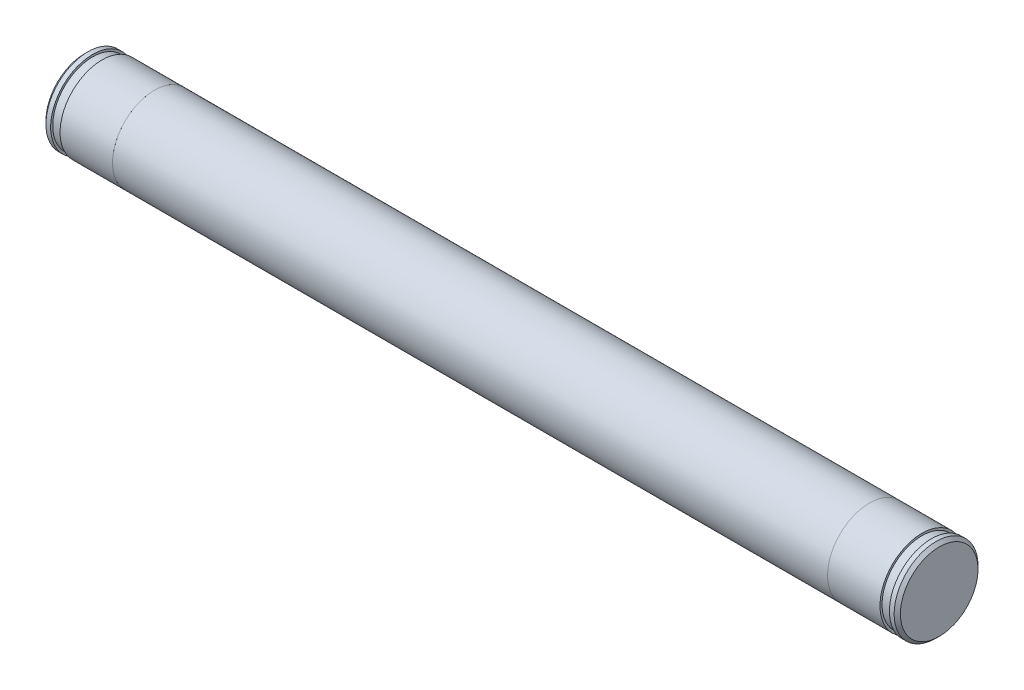
ISO-10303-21;
HEADER;
FILE_DESCRIPTION(('STEP AP214'),'2;1');
FILE_NAME('part.step','',(''),(''),'','','');
FILE_SCHEMA(('AUTOMOTIVE_DESIGN { 1 0 10303 214 1 1 1 1 }'));
ENDSEC;
DATA;
#1=APPLICATION_CONTEXT('core data for automotive mechanical design processes');
#2=APPLICATION_PROTOCOL_DEFINITION('international standard','automotive_design',2000,#1);
#3=PRODUCT_CONTEXT('',#1,'mechanical');
#4=PRODUCT('Part','Part','',(#3));
#5=PRODUCT_RELATED_PRODUCT_CATEGORY('part','',(#4));
#6=PRODUCT_DEFINITION_FORMATION('','',#4);
#7=PRODUCT_DEFINITION_CONTEXT('part definition',#1,'design');
#8=PRODUCT_DEFINITION('design','',#6,#7);
#9=PRODUCT_DEFINITION_SHAPE('','',#8);
#10=(LENGTH_UNIT() NAMED_UNIT(*) SI_UNIT(.MILLI.,.METRE.));
#11=(NAMED_UNIT(*) PLANE_ANGLE_UNIT() SI_UNIT($,.RADIAN.));
#12=(NAMED_UNIT(*) SI_UNIT($,.STERADIAN.) SOLID_ANGLE_UNIT());
#13=UNCERTAINTY_MEASURE_WITH_UNIT(LENGTH_MEASURE(1.E-05),#10,'distance_accuracy_value','');
#14=(GEOMETRIC_REPRESENTATION_CONTEXT(3) GLOBAL_UNCERTAINTY_ASSIGNED_CONTEXT((#13)) GLOBAL_UNIT_ASSIGNED_CONTEXT((#10,
#11,#12)) REPRESENTATION_CONTEXT('',''));
#15=CARTESIAN_POINT('',(0.,0.,0.));
#16=DIRECTION('',(0.,0.,1.));
#17=DIRECTION('',(1.,0.,0.));
#18=AXIS2_PLACEMENT_3D('',#15,#16,#17);
#19=CARTESIAN_POINT('',(40.75,0.,0.));
#20=DIRECTION('',(1.,0.,0.));
#21=DIRECTION('',(0.,0.,-1.));
#22=AXIS2_PLACEMENT_3D('',#19,#20,#21);
#23=PLANE('',#22);
#24=CARTESIAN_POINT('',(40.7499999999459,0.,0.));
#25=DIRECTION('',(-1.,0.,0.));
#26=DIRECTION('',(0.,0.,1.));
#27=AXIS2_PLACEMENT_3D('',#24,#25,#26);
#28=CIRCLE('',#27,3.69999999992388);
#29=CARTESIAN_POINT('',(40.7499999999459,0.,3.69999999992388));
#30=VERTEX_POINT('',#29);
#31=EDGE_CURVE('E18',#30,#30,#28,.T.);
#32=ORIENTED_EDGE('',*,*,#31,.F.);
#33=EDGE_LOOP('',(#32));
#34=FACE_BOUND('',#33,.T.);
#35=ADVANCED_FACE('F15',(#34),#23,.T.);
#36=CARTESIAN_POINT('',(-40.75,0.,0.));
#37=DIRECTION('',(-1.,0.,0.));
#38=DIRECTION('',(0.,0.,1.));
#39=AXIS2_PLACEMENT_3D('',#36,#37,#38);
#40=PLANE('',#39);
#41=CARTESIAN_POINT('',(-40.7500000000027,0.,0.));
#42=DIRECTION('',(1.,0.,0.));
#43=DIRECTION('',(0.,0.,-1.));
#44=AXIS2_PLACEMENT_3D('',#41,#42,#43);
#45=CIRCLE('',#44,3.69999999998072);
#46=CARTESIAN_POINT('',(-40.7500000000027,0.,-3.69999999998072));
#47=VERTEX_POINT('',#46);
#48=EDGE_CURVE('E62',#47,#47,#45,.T.);
#49=ORIENTED_EDGE('',*,*,#48,.F.);
#50=EDGE_LOOP('',(#49));
#51=FACE_BOUND('',#50,.T.);
#52=ADVANCED_FACE('F75',(#51),#40,.T.);
#53=CARTESIAN_POINT('',(40.4499999999643,0.,0.));
#54=DIRECTION('',(-1.,0.,0.));
#55=DIRECTION('',(0.,0.,1.));
#56=AXIS2_PLACEMENT_3D('',#53,#54,#55);
#57=CONICAL_SURFACE('',#56,3.99999999990541,0.785398163397448);
#58=ORIENTED_EDGE('',*,*,#31,.T.);
#59=EDGE_LOOP('',(#58));
#60=FACE_BOUND('',#59,.T.);
#61=CARTESIAN_POINT('',(40.45,0.,0.));
#62=DIRECTION('',(1.,0.,0.));
#63=DIRECTION('',(0.,0.,-1.));
#64=AXIS2_PLACEMENT_3D('',#61,#62,#63);
#65=CIRCLE('',#64,4.);
#66=CARTESIAN_POINT('',(40.45,0.,-4.));
#67=VERTEX_POINT('',#66);
#68=EDGE_CURVE('E64',#67,#67,#65,.F.);
#69=ORIENTED_EDGE('',*,*,#68,.F.);
#70=EDGE_LOOP('',(#69));
#71=FACE_BOUND('',#70,.T.);
#72=ADVANCED_FACE('F71',(#60,#71),#57,.T.);
#73=CARTESIAN_POINT('',(-40.4499999999643,0.,0.));
#74=DIRECTION('',(1.,0.,0.));
#75=DIRECTION('',(0.,0.,-1.));
#76=AXIS2_PLACEMENT_3D('',#73,#74,#75);
#77=CONICAL_SURFACE('',#76,4.0000000000191,0.785398163397448);
#78=ORIENTED_EDGE('',*,*,#48,.T.);
#79=EDGE_LOOP('',(#78));
#80=FACE_BOUND('',#79,.T.);
#81=CARTESIAN_POINT('',(-40.45,0.,0.));
#82=DIRECTION('',(1.,0.,0.));
#83=DIRECTION('',(0.,0.,-1.));
#84=AXIS2_PLACEMENT_3D('',#81,#82,#83);
#85=CIRCLE('',#84,4.);
#86=CARTESIAN_POINT('',(-40.45,0.,-4.));
#87=VERTEX_POINT('',#86);
#88=EDGE_CURVE('E61',#87,#87,#85,.T.);
#89=ORIENTED_EDGE('',*,*,#88,.F.);
#90=EDGE_LOOP('',(#89));
#91=FACE_BOUND('',#90,.T.);
#92=ADVANCED_FACE('F135',(#80,#91),#77,.T.);
#93=CARTESIAN_POINT('',(40.75,0.,0.));
#94=DIRECTION('',(1.,0.,0.));
#95=DIRECTION('',(0.,0.,-1.));
#96=AXIS2_PLACEMENT_3D('',#93,#94,#95);
#97=CYLINDRICAL_SURFACE('',#96,4.);
#98=CARTESIAN_POINT('',(40.,0.,0.));
#99=DIRECTION('',(1.,0.,0.));
#100=DIRECTION('',(0.,0.,-1.));
#101=AXIS2_PLACEMENT_3D('',#98,#99,#100);
#102=CIRCLE('',#101,4.);
#103=CARTESIAN_POINT('',(40.,0.,-4.));
#104=VERTEX_POINT('',#103);
#105=EDGE_CURVE('E59',#104,#104,#102,.F.);
#106=ORIENTED_EDGE('',*,*,#105,.F.);
#107=EDGE_LOOP('',(#106));
#108=FACE_BOUND('',#107,.T.);
#109=ORIENTED_EDGE('',*,*,#68,.T.);
#110=EDGE_LOOP('',(#109));
#111=FACE_BOUND('',#110,.T.);
#112=ADVANCED_FACE('F131',(#108,#111),#97,.T.);
#113=CARTESIAN_POINT('',(40.75,0.,0.));
#114=DIRECTION('',(1.,0.,0.));
#115=DIRECTION('',(0.,0.,-1.));
#116=AXIS2_PLACEMENT_3D('',#113,#114,#115);
#117=CYLINDRICAL_SURFACE('',#116,4.);
#118=ORIENTED_EDGE('',*,*,#88,.T.);
#119=EDGE_LOOP('',(#118));
#120=FACE_BOUND('',#119,.T.);
#121=CARTESIAN_POINT('',(-40.,0.,0.));
#122=DIRECTION('',(1.,0.,0.));
#123=DIRECTION('',(0.,0.,-1.));
#124=AXIS2_PLACEMENT_3D('',#121,#122,#123);
#125=CIRCLE('',#124,4.);
#126=CARTESIAN_POINT('',(-40.,0.,-4.));
#127=VERTEX_POINT('',#126);
#128=EDGE_CURVE('E56',#127,#127,#125,.T.);
#129=ORIENTED_EDGE('',*,*,#128,.F.);
#130=EDGE_LOOP('',(#129));
#131=FACE_BOUND('',#130,.T.);
#132=ADVANCED_FACE('F127',(#120,#131),#117,.T.);
#133=CARTESIAN_POINT('',(40.,4.00000000000001,0.));
#134=DIRECTION('',(-1.,0.,0.));
#135=DIRECTION('',(0.,0.,1.));
#136=AXIS2_PLACEMENT_3D('',#133,#134,#135);
#137=PLANE('',#136);
#138=CARTESIAN_POINT('',(40.,0.,0.));
#139=DIRECTION('',(1.,0.,0.));
#140=DIRECTION('',(0.,0.,-1.));
#141=AXIS2_PLACEMENT_3D('',#138,#139,#140);
#142=CIRCLE('',#141,3.8);
#143=CARTESIAN_POINT('',(40.,0.,-3.8));
#144=VERTEX_POINT('',#143);
#145=EDGE_CURVE('E53',#144,#144,#142,.F.);
#146=ORIENTED_EDGE('',*,*,#145,.F.);
#147=EDGE_LOOP('',(#146));
#148=FACE_BOUND('',#147,.T.);
#149=ORIENTED_EDGE('',*,*,#105,.T.);
#150=EDGE_LOOP('',(#149));
#151=FACE_BOUND('',#150,.T.);
#152=ADVANCED_FACE('F123',(#148,#151),#137,.T.);
#153=CARTESIAN_POINT('',(-40.,4.00000000000001,0.));
#154=DIRECTION('',(1.,0.,0.));
#155=DIRECTION('',(0.,0.,-1.));
#156=AXIS2_PLACEMENT_3D('',#153,#154,#155);
#157=PLANE('',#156);
#158=CARTESIAN_POINT('',(-40.,0.,0.));
#159=DIRECTION('',(1.,0.,0.));
#160=DIRECTION('',(0.,0.,-1.));
#161=AXIS2_PLACEMENT_3D('',#158,#159,#160);
#162=CIRCLE('',#161,3.8);
#163=CARTESIAN_POINT('',(-40.,0.,-3.8));
#164=VERTEX_POINT('',#163);
#165=EDGE_CURVE('E50',#164,#164,#162,.T.);
#166=ORIENTED_EDGE('',*,*,#165,.F.);
#167=EDGE_LOOP('',(#166));
#168=FACE_BOUND('',#167,.T.);
#169=ORIENTED_EDGE('',*,*,#128,.T.);
#170=EDGE_LOOP('',(#169));
#171=FACE_BOUND('',#170,.T.);
#172=ADVANCED_FACE('F119',(#168,#171),#157,.T.);
#173=CARTESIAN_POINT('',(40.75,0.,0.));
#174=DIRECTION('',(1.,0.,0.));
#175=DIRECTION('',(0.,0.,-1.));
#176=AXIS2_PLACEMENT_3D('',#173,#174,#175);
#177=CYLINDRICAL_SURFACE('',#176,3.8);
#178=CARTESIAN_POINT('',(39.1,0.,0.));
#179=DIRECTION('',(1.,0.,0.));
#180=DIRECTION('',(0.,0.,-1.));
#181=AXIS2_PLACEMENT_3D('',#178,#179,#180);
#182=CIRCLE('',#181,3.8);
#183=CARTESIAN_POINT('',(39.1,0.,-3.8));
#184=VERTEX_POINT('',#183);
#185=EDGE_CURVE('E47',#184,#184,#182,.F.);
#186=ORIENTED_EDGE('',*,*,#185,.F.);
#187=EDGE_LOOP('',(#186));
#188=FACE_BOUND('',#187,.T.);
#189=ORIENTED_EDGE('',*,*,#145,.T.);
#190=EDGE_LOOP('',(#189));
#191=FACE_BOUND('',#190,.T.);
#192=ADVANCED_FACE('F115',(#188,#191),#177,.T.);
#193=CARTESIAN_POINT('',(40.75,0.,0.));
#194=DIRECTION('',(1.,0.,0.));
#195=DIRECTION('',(0.,0.,-1.));
#196=AXIS2_PLACEMENT_3D('',#193,#194,#195);
#197=CYLINDRICAL_SURFACE('',#196,3.8);
#198=ORIENTED_EDGE('',*,*,#165,.T.);
#199=EDGE_LOOP('',(#198));
#200=FACE_BOUND('',#199,.T.);
#201=CARTESIAN_POINT('',(-39.1,0.,0.));
#202=DIRECTION('',(1.,0.,0.));
#203=DIRECTION('',(0.,0.,-1.));
#204=AXIS2_PLACEMENT_3D('',#201,#202,#203);
#205=CIRCLE('',#204,3.8);
#206=CARTESIAN_POINT('',(-39.1,0.,-3.8));
#207=VERTEX_POINT('',#206);
#208=EDGE_CURVE('E44',#207,#207,#205,.T.);
#209=ORIENTED_EDGE('',*,*,#208,.F.);
#210=EDGE_LOOP('',(#209));
#211=FACE_BOUND('',#210,.T.);
#212=ADVANCED_FACE('F111',(#200,#211),#197,.T.);
#213=CARTESIAN_POINT('',(39.1,3.80000000000001,0.));
#214=DIRECTION('',(1.,0.,0.));
#215=DIRECTION('',(0.,0.,-1.));
#216=AXIS2_PLACEMENT_3D('',#213,#214,#215);
#217=PLANE('',#216);
#218=ORIENTED_EDGE('',*,*,#185,.T.);
#219=EDGE_LOOP('',(#218));
#220=FACE_BOUND('',#219,.T.);
#221=CARTESIAN_POINT('',(39.1,0.,0.));
#222=DIRECTION('',(1.,0.,0.));
#223=DIRECTION('',(0.,0.,-1.));
#224=AXIS2_PLACEMENT_3D('',#221,#222,#223);
#225=CIRCLE('',#224,3.99999999999999);
#226=CARTESIAN_POINT('',(39.1,0.,-3.99999999999999));
#227=VERTEX_POINT('',#226);
#228=EDGE_CURVE('E41',#227,#227,#225,.F.);
#229=ORIENTED_EDGE('',*,*,#228,.F.);
#230=EDGE_LOOP('',(#229));
#231=FACE_BOUND('',#230,.T.);
#232=ADVANCED_FACE('F107',(#220,#231),#217,.T.);
#233=CARTESIAN_POINT('',(-39.1,3.80000000000001,0.));
#234=DIRECTION('',(-1.,0.,0.));
#235=DIRECTION('',(0.,0.,1.));
#236=AXIS2_PLACEMENT_3D('',#233,#234,#235);
#237=PLANE('',#236);
#238=ORIENTED_EDGE('',*,*,#208,.T.);
#239=EDGE_LOOP('',(#238));
#240=FACE_BOUND('',#239,.T.);
#241=CARTESIAN_POINT('',(-39.1,0.,0.));
#242=DIRECTION('',(1.,0.,0.));
#243=DIRECTION('',(0.,0.,-1.));
#244=AXIS2_PLACEMENT_3D('',#241,#242,#243);
#245=CIRCLE('',#244,3.99999999999999);
#246=CARTESIAN_POINT('',(-39.1,0.,-3.99999999999999));
#247=VERTEX_POINT('',#246);
#248=EDGE_CURVE('E38',#247,#247,#245,.T.);
#249=ORIENTED_EDGE('',*,*,#248,.F.);
#250=EDGE_LOOP('',(#249));
#251=FACE_BOUND('',#250,.T.);
#252=ADVANCED_FACE('F103',(#240,#251),#237,.T.);
#253=CARTESIAN_POINT('',(40.75,0.,0.));
#254=DIRECTION('',(1.,0.,0.));
#255=DIRECTION('',(0.,0.,-1.));
#256=AXIS2_PLACEMENT_3D('',#253,#254,#255);
#257=CYLINDRICAL_SURFACE('',#256,3.99999999999999);
#258=CARTESIAN_POINT('',(34.1,0.,0.));
#259=DIRECTION('',(1.,0.,0.));
#260=DIRECTION('',(0.,0.,-1.));
#261=AXIS2_PLACEMENT_3D('',#258,#259,#260);
#262=CIRCLE('',#261,3.99999999999999);
#263=CARTESIAN_POINT('',(34.1,0.,-3.99999999999999));
#264=VERTEX_POINT('',#263);
#265=EDGE_CURVE('E35',#264,#264,#262,.F.);
#266=ORIENTED_EDGE('',*,*,#265,.F.);
#267=EDGE_LOOP('',(#266));
#268=FACE_BOUND('',#267,.T.);
#269=ORIENTED_EDGE('',*,*,#228,.T.);
#270=EDGE_LOOP('',(#269));
#271=FACE_BOUND('',#270,.T.);
#272=ADVANCED_FACE('F99',(#268,#271),#257,.T.);
#273=CARTESIAN_POINT('',(40.75,0.,0.));
#274=DIRECTION('',(1.,0.,0.));
#275=DIRECTION('',(0.,0.,-1.));
#276=AXIS2_PLACEMENT_3D('',#273,#274,#275);
#277=CYLINDRICAL_SURFACE('',#276,3.99999999999999);
#278=ORIENTED_EDGE('',*,*,#248,.T.);
#279=EDGE_LOOP('',(#278));
#280=FACE_BOUND('',#279,.T.);
#281=CARTESIAN_POINT('',(-34.1,0.,0.));
#282=DIRECTION('',(1.,0.,0.));
#283=DIRECTION('',(0.,0.,-1.));
#284=AXIS2_PLACEMENT_3D('',#281,#282,#283);
#285=CIRCLE('',#284,3.99999999999999);
#286=CARTESIAN_POINT('',(-34.1,0.,-3.99999999999999));
#287=VERTEX_POINT('',#286);
#288=EDGE_CURVE('E27',#287,#287,#285,.T.);
#289=ORIENTED_EDGE('',*,*,#288,.F.);
#290=EDGE_LOOP('',(#289));
#291=FACE_BOUND('',#290,.T.);
#292=ADVANCED_FACE('F95',(#280,#291),#277,.T.);
#293=CARTESIAN_POINT('',(34.1,3.99900000000064,0.));
#294=DIRECTION('',(-1.,0.,0.));
#295=DIRECTION('',(0.,0.,1.));
#296=AXIS2_PLACEMENT_3D('',#293,#294,#295);
#297=PLANE('',#296);
#298=CARTESIAN_POINT('',(34.1,0.,0.));
#299=DIRECTION('',(1.,0.,0.));
#300=DIRECTION('',(0.,0.,-1.));
#301=AXIS2_PLACEMENT_3D('',#298,#299,#300);
#302=CIRCLE('',#301,3.99900000000031);
#303=CARTESIAN_POINT('',(34.1,0.,-3.99900000000031));
#304=VERTEX_POINT('',#303);
#305=EDGE_CURVE('E22',#304,#304,#302,.F.);
#306=ORIENTED_EDGE('',*,*,#305,.F.);
#307=EDGE_LOOP('',(#306));
#308=FACE_BOUND('',#307,.T.);
#309=ORIENTED_EDGE('',*,*,#265,.T.);
#310=EDGE_LOOP('',(#309));
#311=FACE_BOUND('',#310,.T.);
#312=ADVANCED_FACE('F88',(#308,#311),#297,.T.);
#313=CARTESIAN_POINT('',(-34.1,3.99999999999999,0.));
#314=DIRECTION('',(1.,0.,0.));
#315=DIRECTION('',(0.,0.,-1.));
#316=AXIS2_PLACEMENT_3D('',#313,#314,#315);
#317=PLANE('',#316);
#318=CARTESIAN_POINT('',(-34.1,0.,0.));
#319=DIRECTION('',(1.,0.,0.));
#320=DIRECTION('',(0.,0.,-1.));
#321=AXIS2_PLACEMENT_3D('',#318,#319,#320);
#322=CIRCLE('',#321,3.99900000000031);
#323=CARTESIAN_POINT('',(-34.1,0.,-3.99900000000031));
#324=VERTEX_POINT('',#323);
#325=EDGE_CURVE('E10',#324,#324,#322,.T.);
#326=ORIENTED_EDGE('',*,*,#325,.F.);
#327=EDGE_LOOP('',(#326));
#328=FACE_BOUND('',#327,.T.);
#329=ORIENTED_EDGE('',*,*,#288,.T.);
#330=EDGE_LOOP('',(#329));
#331=FACE_BOUND('',#330,.T.);
#332=ADVANCED_FACE('F83',(#328,#331),#317,.T.);
#333=CARTESIAN_POINT('',(40.75,0.,0.));
#334=DIRECTION('',(1.,0.,0.));
#335=DIRECTION('',(0.,0.,-1.));
#336=AXIS2_PLACEMENT_3D('',#333,#334,#335);
#337=CYLINDRICAL_SURFACE('',#336,3.99900000000031);
#338=ORIENTED_EDGE('',*,*,#325,.T.);
#339=EDGE_LOOP('',(#338));
#340=FACE_BOUND('',#339,.T.);
#341=ORIENTED_EDGE('',*,*,#305,.T.);
#342=EDGE_LOOP('',(#341));
#343=FACE_BOUND('',#342,.T.);
#344=ADVANCED_FACE('F81',(#340,#343),#337,.T.);
#345=CLOSED_SHELL('',(#35,#52,#72,#92,#112,#132,#152,#172,#192,#212,#232,#252,#272,#292,#312,
#332,#344));
#346=MANIFOLD_SOLID_BREP('B1',#345);
#347=ADVANCED_BREP_SHAPE_REPRESENTATION('',(#18,#346),#14);
#348=SHAPE_DEFINITION_REPRESENTATION(#9,#347);
ENDSEC;
END-ISO-10303-21;
